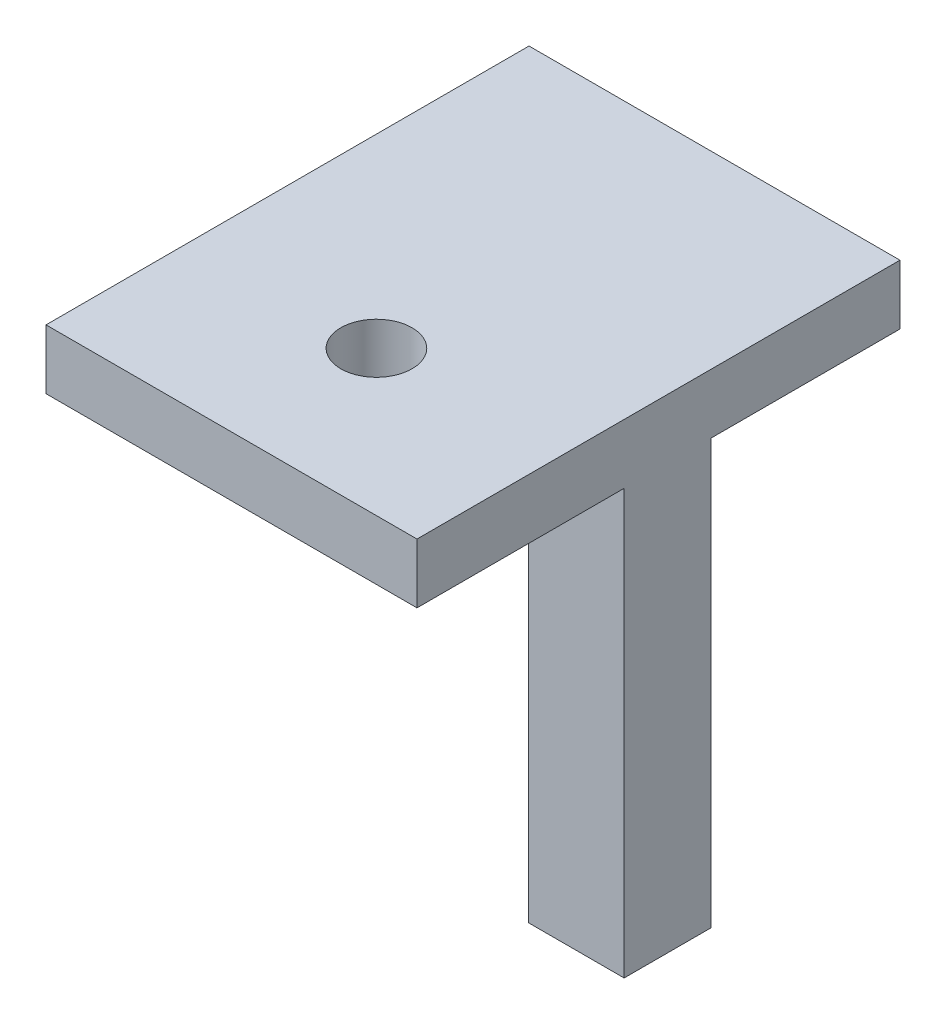
ISO-10303-21;
HEADER;
FILE_DESCRIPTION(('STEP AP214'),'2;1');
FILE_NAME('part.step','',(''),(''),'','','');
FILE_SCHEMA(('AUTOMOTIVE_DESIGN { 1 0 10303 214 1 1 1 1 }'));
ENDSEC;
DATA;
#1=APPLICATION_CONTEXT('core data for automotive mechanical design processes');
#2=APPLICATION_PROTOCOL_DEFINITION('international standard','automotive_design',2000,#1);
#3=PRODUCT_CONTEXT('',#1,'mechanical');
#4=PRODUCT('Part','Part','',(#3));
#5=PRODUCT_RELATED_PRODUCT_CATEGORY('part','',(#4));
#6=PRODUCT_DEFINITION_FORMATION('','',#4);
#7=PRODUCT_DEFINITION_CONTEXT('part definition',#1,'design');
#8=PRODUCT_DEFINITION('design','',#6,#7);
#9=PRODUCT_DEFINITION_SHAPE('','',#8);
#10=(LENGTH_UNIT() NAMED_UNIT(*) SI_UNIT(.MILLI.,.METRE.));
#11=(NAMED_UNIT(*) PLANE_ANGLE_UNIT() SI_UNIT($,.RADIAN.));
#12=(NAMED_UNIT(*) SI_UNIT($,.STERADIAN.) SOLID_ANGLE_UNIT());
#13=UNCERTAINTY_MEASURE_WITH_UNIT(LENGTH_MEASURE(1.E-05),#10,'distance_accuracy_value','');
#14=(GEOMETRIC_REPRESENTATION_CONTEXT(3) GLOBAL_UNCERTAINTY_ASSIGNED_CONTEXT((#13)) GLOBAL_UNIT_ASSIGNED_CONTEXT((#10,
#11,#12)) REPRESENTATION_CONTEXT('',''));
#15=CARTESIAN_POINT('',(0.,0.,0.));
#16=DIRECTION('',(0.,0.,1.));
#17=DIRECTION('',(1.,0.,0.));
#18=AXIS2_PLACEMENT_3D('',#15,#16,#17);
#19=CARTESIAN_POINT('',(0.,0.,0.));
#20=DIRECTION('',(0.,1.,0.));
#21=DIRECTION('',(0.,0.,1.));
#22=AXIS2_PLACEMENT_3D('',#19,#20,#21);
#23=PLANE('',#22);
#24=CARTESIAN_POINT('',(0.,0.,16.192065));
#25=DIRECTION('',(0.,1.,0.));
#26=DIRECTION('',(0.,0.,1.));
#27=AXIS2_PLACEMENT_3D('',#24,#25,#26);
#28=CIRCLE('',#27,5.969);
#29=CARTESIAN_POINT('',(0.,0.,22.161065));
#30=VERTEX_POINT('',#29);
#31=EDGE_CURVE('E142',#30,#30,#28,.T.);
#32=ORIENTED_EDGE('',*,*,#31,.T.);
#33=EDGE_LOOP('',(#32));
#34=FACE_BOUND('',#33,.T.);
#35=DIRECTION('',(1.,0.,0.));
#36=VECTOR('',#35,1.);
#37=CARTESIAN_POINT('',(31.1,0.,-8.792065));
#38=LINE('',#37,#36);
#39=CARTESIAN_POINT('',(15.1,0.,-8.792065));
#40=VERTEX_POINT('',#39);
#41=CARTESIAN_POINT('',(31.1,0.,-8.792065));
#42=VERTEX_POINT('',#41);
#43=EDGE_CURVE('E61',#40,#42,#38,.T.);
#44=ORIENTED_EDGE('',*,*,#43,.F.);
#45=DIRECTION('',(0.,0.,-1.));
#46=VECTOR('',#45,1.);
#47=CARTESIAN_POINT('',(15.1,0.,-8.792065));
#48=LINE('',#47,#46);
#49=CARTESIAN_POINT('',(15.1,0.,5.760575));
#50=VERTEX_POINT('',#49);
#51=EDGE_CURVE('E304',#50,#40,#48,.T.);
#52=ORIENTED_EDGE('',*,*,#51,.F.);
#53=DIRECTION('',(-1.,0.,0.));
#54=VECTOR('',#53,1.);
#55=CARTESIAN_POINT('',(31.1,0.,5.760575));
#56=LINE('',#55,#54);
#57=CARTESIAN_POINT('',(31.1,0.,5.760575));
#58=VERTEX_POINT('',#57);
#59=EDGE_CURVE('E314',#58,#50,#56,.T.);
#60=ORIENTED_EDGE('',*,*,#59,.F.);
#61=DIRECTION('',(0.,0.,-1.));
#62=VECTOR('',#61,1.);
#63=CARTESIAN_POINT('',(31.1,0.,-40.492065));
#64=LINE('',#63,#62);
#65=CARTESIAN_POINT('',(31.1,0.,40.492065));
#66=VERTEX_POINT('',#65);
#67=EDGE_CURVE('E135',#66,#58,#64,.T.);
#68=ORIENTED_EDGE('',*,*,#67,.F.);
#69=DIRECTION('',(1.,0.,0.));
#70=VECTOR('',#69,1.);
#71=CARTESIAN_POINT('',(-31.1,0.,40.492065));
#72=LINE('',#71,#70);
#73=CARTESIAN_POINT('',(-31.1,0.,40.492065));
#74=VERTEX_POINT('',#73);
#75=EDGE_CURVE('E156',#74,#66,#72,.T.);
#76=ORIENTED_EDGE('',*,*,#75,.F.);
#77=DIRECTION('',(0.,0.,1.));
#78=VECTOR('',#77,1.);
#79=CARTESIAN_POINT('',(-31.1,0.,-40.492065));
#80=LINE('',#79,#78);
#81=CARTESIAN_POINT('',(-31.1,0.,-40.492065));
#82=VERTEX_POINT('',#81);
#83=EDGE_CURVE('E171',#82,#74,#80,.T.);
#84=ORIENTED_EDGE('',*,*,#83,.F.);
#85=DIRECTION('',(-1.,0.,0.));
#86=VECTOR('',#85,1.);
#87=CARTESIAN_POINT('',(-31.1,0.,-40.492065));
#88=LINE('',#87,#86);
#89=CARTESIAN_POINT('',(31.1,0.,-40.492065));
#90=VERTEX_POINT('',#89);
#91=EDGE_CURVE('E168',#90,#82,#88,.T.);
#92=ORIENTED_EDGE('',*,*,#91,.F.);
#93=EDGE_CURVE('E66',#42,#90,#64,.T.);
#94=ORIENTED_EDGE('',*,*,#93,.F.);
#95=EDGE_LOOP('',(#44,#52,#60,#68,#76,#84,#92,#94));
#96=FACE_BOUND('',#95,.T.);
#97=ADVANCED_FACE('F45',(#34,#96),#23,.F.);
#98=CARTESIAN_POINT('',(31.1,10.,-40.492065));
#99=DIRECTION('',(-1.,0.,0.));
#100=DIRECTION('',(0.,0.,1.));
#101=AXIS2_PLACEMENT_3D('',#98,#99,#100);
#102=PLANE('',#101);
#103=ORIENTED_EDGE('',*,*,#67,.T.);
#104=DIRECTION('',(0.,1.,0.));
#105=VECTOR('',#104,1.);
#106=CARTESIAN_POINT('',(31.1,-71.11,5.760575));
#107=LINE('',#106,#105);
#108=CARTESIAN_POINT('',(31.1,-71.11,5.760575));
#109=VERTEX_POINT('',#108);
#110=EDGE_CURVE('E114',#109,#58,#107,.T.);
#111=ORIENTED_EDGE('',*,*,#110,.F.);
#112=DIRECTION('',(0.,0.,1.));
#113=VECTOR('',#112,1.);
#114=CARTESIAN_POINT('',(31.1,-71.11,-8.792065));
#115=LINE('',#114,#113);
#116=CARTESIAN_POINT('',(31.1,-71.11,-8.792065));
#117=VERTEX_POINT('',#116);
#118=EDGE_CURVE('E121',#117,#109,#115,.T.);
#119=ORIENTED_EDGE('',*,*,#118,.F.);
#120=DIRECTION('',(0.,1.,0.));
#121=VECTOR('',#120,1.);
#122=CARTESIAN_POINT('',(31.1,-71.11,-8.792065));
#123=LINE('',#122,#121);
#124=EDGE_CURVE('E301',#117,#42,#123,.T.);
#125=ORIENTED_EDGE('',*,*,#124,.T.);
#126=ORIENTED_EDGE('',*,*,#93,.T.);
#127=DIRECTION('',(0.,-1.,0.));
#128=VECTOR('',#127,1.);
#129=CARTESIAN_POINT('',(31.1,10.,-40.492065));
#130=LINE('',#129,#128);
#131=CARTESIAN_POINT('',(31.1,10.,-40.492065));
#132=VERTEX_POINT('',#131);
#133=EDGE_CURVE('E11',#132,#90,#130,.T.);
#134=ORIENTED_EDGE('',*,*,#133,.F.);
#135=DIRECTION('',(0.,0.,-1.));
#136=VECTOR('',#135,1.);
#137=CARTESIAN_POINT('',(31.1,10.,-40.492065));
#138=LINE('',#137,#136);
#139=CARTESIAN_POINT('',(31.1,10.,40.492065));
#140=VERTEX_POINT('',#139);
#141=EDGE_CURVE('E151',#140,#132,#138,.T.);
#142=ORIENTED_EDGE('',*,*,#141,.F.);
#143=DIRECTION('',(0.,-1.,0.));
#144=VECTOR('',#143,1.);
#145=CARTESIAN_POINT('',(31.1,10.,40.492065));
#146=LINE('',#145,#144);
#147=EDGE_CURVE('E165',#140,#66,#146,.T.);
#148=ORIENTED_EDGE('',*,*,#147,.T.);
#149=EDGE_LOOP('',(#103,#111,#119,#125,#126,#134,#142,#148));
#150=FACE_BOUND('',#149,.T.);
#151=ADVANCED_FACE('F47',(#150),#102,.F.);
#152=CARTESIAN_POINT('',(-31.1,10.,-40.492065));
#153=DIRECTION('',(0.,0.,1.));
#154=DIRECTION('',(1.,0.,0.));
#155=AXIS2_PLACEMENT_3D('',#152,#153,#154);
#156=PLANE('',#155);
#157=ORIENTED_EDGE('',*,*,#91,.T.);
#158=DIRECTION('',(0.,-1.,0.));
#159=VECTOR('',#158,1.);
#160=CARTESIAN_POINT('',(-31.1,10.,-40.492065));
#161=LINE('',#160,#159);
#162=CARTESIAN_POINT('',(-31.1,10.,-40.492065));
#163=VERTEX_POINT('',#162);
#164=EDGE_CURVE('E54',#163,#82,#161,.T.);
#165=ORIENTED_EDGE('',*,*,#164,.F.);
#166=DIRECTION('',(-1.,0.,0.));
#167=VECTOR('',#166,1.);
#168=CARTESIAN_POINT('',(-31.1,10.,-40.492065));
#169=LINE('',#168,#167);
#170=EDGE_CURVE('E155',#132,#163,#169,.T.);
#171=ORIENTED_EDGE('',*,*,#170,.F.);
#172=ORIENTED_EDGE('',*,*,#133,.T.);
#173=EDGE_LOOP('',(#157,#165,#171,#172));
#174=FACE_BOUND('',#173,.T.);
#175=ADVANCED_FACE('F199',(#174),#156,.F.);
#176=CARTESIAN_POINT('',(-31.1,10.,-40.492065));
#177=DIRECTION('',(1.,0.,0.));
#178=DIRECTION('',(0.,0.,-1.));
#179=AXIS2_PLACEMENT_3D('',#176,#177,#178);
#180=PLANE('',#179);
#181=ORIENTED_EDGE('',*,*,#83,.T.);
#182=DIRECTION('',(0.,-1.,0.));
#183=VECTOR('',#182,1.);
#184=CARTESIAN_POINT('',(-31.1,10.,40.492065));
#185=LINE('',#184,#183);
#186=CARTESIAN_POINT('',(-31.1,10.,40.492065));
#187=VERTEX_POINT('',#186);
#188=EDGE_CURVE('E178',#187,#74,#185,.T.);
#189=ORIENTED_EDGE('',*,*,#188,.F.);
#190=DIRECTION('',(0.,0.,1.));
#191=VECTOR('',#190,1.);
#192=CARTESIAN_POINT('',(-31.1,10.,-40.492065));
#193=LINE('',#192,#191);
#194=EDGE_CURVE('E159',#163,#187,#193,.T.);
#195=ORIENTED_EDGE('',*,*,#194,.F.);
#196=ORIENTED_EDGE('',*,*,#164,.T.);
#197=EDGE_LOOP('',(#181,#189,#195,#196));
#198=FACE_BOUND('',#197,.T.);
#199=ADVANCED_FACE('F187',(#198),#180,.F.);
#200=CARTESIAN_POINT('',(-31.1,10.,40.492065));
#201=DIRECTION('',(0.,0.,-1.));
#202=DIRECTION('',(-1.,0.,0.));
#203=AXIS2_PLACEMENT_3D('',#200,#201,#202);
#204=PLANE('',#203);
#205=ORIENTED_EDGE('',*,*,#75,.T.);
#206=ORIENTED_EDGE('',*,*,#147,.F.);
#207=DIRECTION('',(1.,0.,0.));
#208=VECTOR('',#207,1.);
#209=CARTESIAN_POINT('',(-31.1,10.,40.492065));
#210=LINE('',#209,#208);
#211=EDGE_CURVE('E162',#187,#140,#210,.T.);
#212=ORIENTED_EDGE('',*,*,#211,.F.);
#213=ORIENTED_EDGE('',*,*,#188,.T.);
#214=EDGE_LOOP('',(#205,#206,#212,#213));
#215=FACE_BOUND('',#214,.T.);
#216=ADVANCED_FACE('F193',(#215),#204,.F.);
#217=CARTESIAN_POINT('',(0.,10.,0.));
#218=DIRECTION('',(0.,1.,0.));
#219=DIRECTION('',(0.,0.,1.));
#220=AXIS2_PLACEMENT_3D('',#217,#218,#219);
#221=PLANE('',#220);
#222=CARTESIAN_POINT('',(0.,10.,16.192065));
#223=DIRECTION('',(0.,1.,0.));
#224=DIRECTION('',(0.,0.,1.));
#225=AXIS2_PLACEMENT_3D('',#222,#223,#224);
#226=CIRCLE('',#225,5.969);
#227=CARTESIAN_POINT('',(0.,10.,22.161065));
#228=VERTEX_POINT('',#227);
#229=EDGE_CURVE('E137',#228,#228,#226,.T.);
#230=ORIENTED_EDGE('',*,*,#229,.F.);
#231=EDGE_LOOP('',(#230));
#232=FACE_BOUND('',#231,.T.);
#233=ORIENTED_EDGE('',*,*,#141,.T.);
#234=ORIENTED_EDGE('',*,*,#170,.T.);
#235=ORIENTED_EDGE('',*,*,#194,.T.);
#236=ORIENTED_EDGE('',*,*,#211,.T.);
#237=EDGE_LOOP('',(#233,#234,#235,#236));
#238=FACE_BOUND('',#237,.T.);
#239=ADVANCED_FACE('F198',(#232,#238),#221,.T.);
#240=CARTESIAN_POINT('',(0.,0.,16.192065));
#241=DIRECTION('',(0.,1.,0.));
#242=DIRECTION('',(0.,0.,1.));
#243=AXIS2_PLACEMENT_3D('',#240,#241,#242);
#244=CYLINDRICAL_SURFACE('',#243,5.969);
#245=ORIENTED_EDGE('',*,*,#31,.F.);
#246=EDGE_LOOP('',(#245));
#247=FACE_BOUND('',#246,.T.);
#248=ORIENTED_EDGE('',*,*,#229,.T.);
#249=EDGE_LOOP('',(#248));
#250=FACE_BOUND('',#249,.T.);
#251=ADVANCED_FACE('F219',(#247,#250),#244,.F.);
#252=CARTESIAN_POINT('',(31.1,-71.11,5.760575));
#253=DIRECTION('',(0.,0.,-1.));
#254=DIRECTION('',(-1.,0.,0.));
#255=AXIS2_PLACEMENT_3D('',#252,#253,#254);
#256=PLANE('',#255);
#257=ORIENTED_EDGE('',*,*,#59,.T.);
#258=DIRECTION('',(0.,1.,0.));
#259=VECTOR('',#258,1.);
#260=CARTESIAN_POINT('',(15.1,-71.11,5.760575));
#261=LINE('',#260,#259);
#262=CARTESIAN_POINT('',(15.1,-71.11,5.760575));
#263=VERTEX_POINT('',#262);
#264=EDGE_CURVE('E116',#263,#50,#261,.T.);
#265=ORIENTED_EDGE('',*,*,#264,.F.);
#266=DIRECTION('',(-1.,0.,0.));
#267=VECTOR('',#266,1.);
#268=CARTESIAN_POINT('',(31.1,-71.11,5.760575));
#269=LINE('',#268,#267);
#270=EDGE_CURVE('E109',#109,#263,#269,.T.);
#271=ORIENTED_EDGE('',*,*,#270,.F.);
#272=ORIENTED_EDGE('',*,*,#110,.T.);
#273=EDGE_LOOP('',(#257,#265,#271,#272));
#274=FACE_BOUND('',#273,.T.);
#275=ADVANCED_FACE('F112',(#274),#256,.F.);
#276=CARTESIAN_POINT('',(15.1,-71.11,-8.792065));
#277=DIRECTION('',(1.,0.,0.));
#278=DIRECTION('',(0.,0.,-1.));
#279=AXIS2_PLACEMENT_3D('',#276,#277,#278);
#280=PLANE('',#279);
#281=ORIENTED_EDGE('',*,*,#51,.T.);
#282=DIRECTION('',(0.,1.,0.));
#283=VECTOR('',#282,1.);
#284=CARTESIAN_POINT('',(15.1,-71.11,-8.792065));
#285=LINE('',#284,#283);
#286=CARTESIAN_POINT('',(15.1,-71.11,-8.792065));
#287=VERTEX_POINT('',#286);
#288=EDGE_CURVE('E144',#287,#40,#285,.T.);
#289=ORIENTED_EDGE('',*,*,#288,.F.);
#290=DIRECTION('',(0.,0.,-1.));
#291=VECTOR('',#290,1.);
#292=CARTESIAN_POINT('',(15.1,-71.11,-8.792065));
#293=LINE('',#292,#291);
#294=EDGE_CURVE('E120',#263,#287,#293,.T.);
#295=ORIENTED_EDGE('',*,*,#294,.F.);
#296=ORIENTED_EDGE('',*,*,#264,.T.);
#297=EDGE_LOOP('',(#281,#289,#295,#296));
#298=FACE_BOUND('',#297,.T.);
#299=ADVANCED_FACE('F229',(#298),#280,.F.);
#300=CARTESIAN_POINT('',(31.1,-71.11,-8.792065));
#301=DIRECTION('',(0.,0.,1.));
#302=DIRECTION('',(1.,0.,0.));
#303=AXIS2_PLACEMENT_3D('',#300,#301,#302);
#304=PLANE('',#303);
#305=ORIENTED_EDGE('',*,*,#43,.T.);
#306=ORIENTED_EDGE('',*,*,#124,.F.);
#307=DIRECTION('',(1.,0.,0.));
#308=VECTOR('',#307,1.);
#309=CARTESIAN_POINT('',(31.1,-71.11,-8.792065));
#310=LINE('',#309,#308);
#311=EDGE_CURVE('E126',#287,#117,#310,.T.);
#312=ORIENTED_EDGE('',*,*,#311,.F.);
#313=ORIENTED_EDGE('',*,*,#288,.T.);
#314=EDGE_LOOP('',(#305,#306,#312,#313));
#315=FACE_BOUND('',#314,.T.);
#316=ADVANCED_FACE('F235',(#315),#304,.F.);
#317=CARTESIAN_POINT('',(0.,-71.11,0.));
#318=DIRECTION('',(0.,-1.,0.));
#319=DIRECTION('',(0.,0.,-1.));
#320=AXIS2_PLACEMENT_3D('',#317,#318,#319);
#321=PLANE('',#320);
#322=ORIENTED_EDGE('',*,*,#118,.T.);
#323=ORIENTED_EDGE('',*,*,#270,.T.);
#324=ORIENTED_EDGE('',*,*,#294,.T.);
#325=ORIENTED_EDGE('',*,*,#311,.T.);
#326=EDGE_LOOP('',(#322,#323,#324,#325));
#327=FACE_BOUND('',#326,.T.);
#328=ADVANCED_FACE('F124',(#327),#321,.T.);
#329=CLOSED_SHELL('',(#97,#151,#175,#199,#216,#239,#251,#275,#299,#316,#328));
#330=MANIFOLD_SOLID_BREP('B2',#329);
#331=ADVANCED_BREP_SHAPE_REPRESENTATION('',(#18,#330),#14);
#332=SHAPE_DEFINITION_REPRESENTATION(#9,#331);
ENDSEC;
END-ISO-10303-21;
